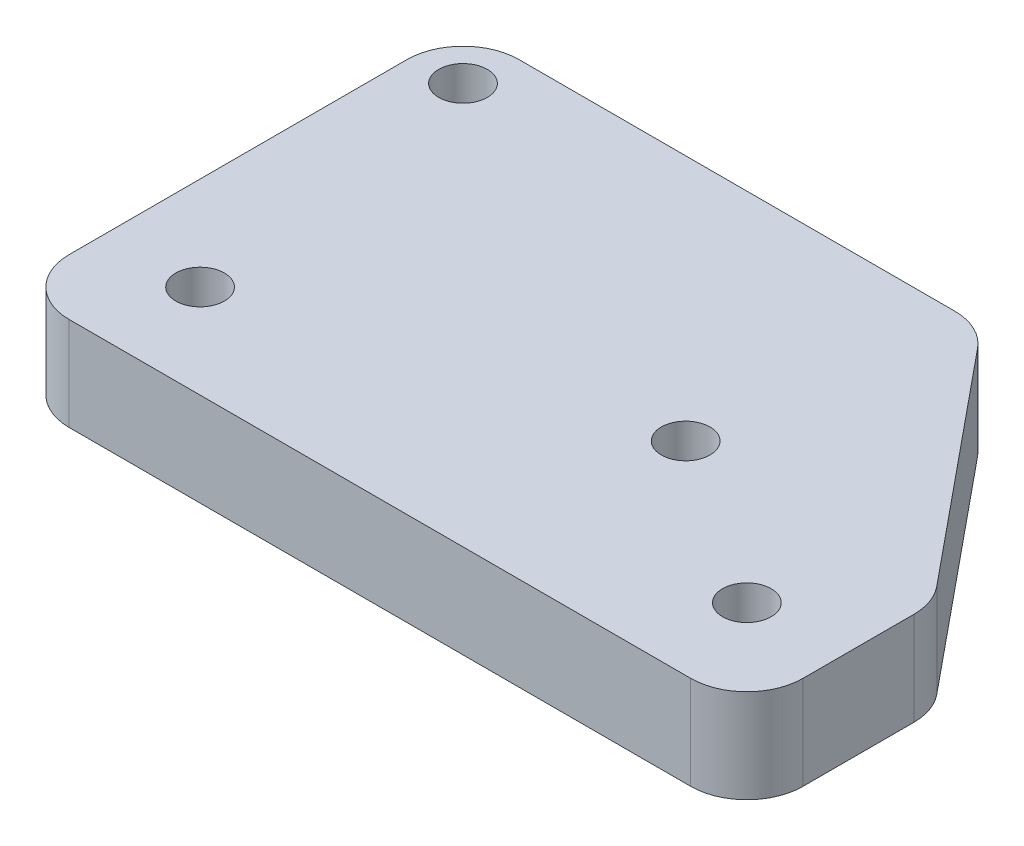
ISO-10303-21;
HEADER;
FILE_DESCRIPTION(('STEP AP214'),'2;1');
FILE_NAME('part.step','',(''),(''),'','','');
FILE_SCHEMA(('AUTOMOTIVE_DESIGN { 1 0 10303 214 1 1 1 1 }'));
ENDSEC;
DATA;
#1=APPLICATION_CONTEXT('core data for automotive mechanical design processes');
#2=APPLICATION_PROTOCOL_DEFINITION('international standard','automotive_design',2000,#1);
#3=PRODUCT_CONTEXT('',#1,'mechanical');
#4=PRODUCT('Part','Part','',(#3));
#5=PRODUCT_RELATED_PRODUCT_CATEGORY('part','',(#4));
#6=PRODUCT_DEFINITION_FORMATION('','',#4);
#7=PRODUCT_DEFINITION_CONTEXT('part definition',#1,'design');
#8=PRODUCT_DEFINITION('design','',#6,#7);
#9=PRODUCT_DEFINITION_SHAPE('','',#8);
#10=(LENGTH_UNIT() NAMED_UNIT(*) SI_UNIT(.MILLI.,.METRE.));
#11=(NAMED_UNIT(*) PLANE_ANGLE_UNIT() SI_UNIT($,.RADIAN.));
#12=(NAMED_UNIT(*) SI_UNIT($,.STERADIAN.) SOLID_ANGLE_UNIT());
#13=UNCERTAINTY_MEASURE_WITH_UNIT(LENGTH_MEASURE(1.E-05),#10,'distance_accuracy_value','');
#14=(GEOMETRIC_REPRESENTATION_CONTEXT(3) GLOBAL_UNCERTAINTY_ASSIGNED_CONTEXT((#13)) GLOBAL_UNIT_ASSIGNED_CONTEXT((#10,
#11,#12)) REPRESENTATION_CONTEXT('',''));
#15=CARTESIAN_POINT('',(0.,0.,0.));
#16=DIRECTION('',(0.,0.,1.));
#17=DIRECTION('',(1.,0.,0.));
#18=AXIS2_PLACEMENT_3D('',#15,#16,#17);
#19=CARTESIAN_POINT('',(-13.85,5.,-7.9));
#20=DIRECTION('',(0.,0.,1.));
#21=DIRECTION('',(1.,0.,0.));
#22=AXIS2_PLACEMENT_3D('',#19,#20,#21);
#23=PLANE('',#22);
#24=DIRECTION('',(-1.,0.,0.));
#25=VECTOR('',#24,1.);
#26=CARTESIAN_POINT('',(-13.85,0.,-7.9));
#27=LINE('',#26,#25);
#28=CARTESIAN_POINT('',(12.4302827055357,0.,-7.9));
#29=VERTEX_POINT('',#28);
#30=CARTESIAN_POINT('',(-10.85,0.,-7.9));
#31=VERTEX_POINT('',#30);
#32=EDGE_CURVE('E154',#29,#31,#27,.T.);
#33=ORIENTED_EDGE('',*,*,#32,.T.);
#34=DIRECTION('',(0.,-1.,0.));
#35=VECTOR('',#34,1.);
#36=CARTESIAN_POINT('',(-10.85,5.,-7.9));
#37=LINE('',#36,#35);
#38=CARTESIAN_POINT('',(-10.85,5.,-7.9));
#39=VERTEX_POINT('',#38);
#40=EDGE_CURVE('E128',#31,#39,#37,.F.);
#41=ORIENTED_EDGE('',*,*,#40,.T.);
#42=DIRECTION('',(-1.,0.,0.));
#43=VECTOR('',#42,1.);
#44=CARTESIAN_POINT('',(-13.85,5.,-7.9));
#45=LINE('',#44,#43);
#46=CARTESIAN_POINT('',(12.4302827055357,5.,-7.9));
#47=VERTEX_POINT('',#46);
#48=EDGE_CURVE('E153',#47,#39,#45,.T.);
#49=ORIENTED_EDGE('',*,*,#48,.F.);
#50=DIRECTION('',(0.,-1.,0.));
#51=VECTOR('',#50,1.);
#52=CARTESIAN_POINT('',(12.4302827055357,5.,-7.9));
#53=LINE('',#52,#51);
#54=EDGE_CURVE('E197',#47,#29,#53,.T.);
#55=ORIENTED_EDGE('',*,*,#54,.T.);
#56=EDGE_LOOP('',(#33,#41,#49,#55));
#57=FACE_BOUND('',#56,.T.);
#58=ADVANCED_FACE('F44',(#57),#23,.F.);
#59=CARTESIAN_POINT('',(-13.85,5.,7.9));
#60=DIRECTION('',(1.,0.,0.));
#61=DIRECTION('',(0.,0.,-1.));
#62=AXIS2_PLACEMENT_3D('',#59,#60,#61);
#63=PLANE('',#62);
#64=DIRECTION('',(0.,0.,1.));
#65=VECTOR('',#64,1.);
#66=CARTESIAN_POINT('',(-13.85,0.,7.9));
#67=LINE('',#66,#65);
#68=CARTESIAN_POINT('',(-13.85,0.,-4.9));
#69=VERTEX_POINT('',#68);
#70=CARTESIAN_POINT('',(-13.85,0.,13.15));
#71=VERTEX_POINT('',#70);
#72=EDGE_CURVE('E141',#69,#71,#67,.T.);
#73=ORIENTED_EDGE('',*,*,#72,.T.);
#74=DIRECTION('',(0.,1.,0.));
#75=VECTOR('',#74,1.);
#76=CARTESIAN_POINT('',(-13.85,5.,13.15));
#77=LINE('',#76,#75);
#78=CARTESIAN_POINT('',(-13.85,5.,13.15));
#79=VERTEX_POINT('',#78);
#80=EDGE_CURVE('E146',#71,#79,#77,.T.);
#81=ORIENTED_EDGE('',*,*,#80,.T.);
#82=DIRECTION('',(0.,0.,1.));
#83=VECTOR('',#82,1.);
#84=CARTESIAN_POINT('',(-13.85,5.,7.9));
#85=LINE('',#84,#83);
#86=CARTESIAN_POINT('',(-13.85,5.,-4.9));
#87=VERTEX_POINT('',#86);
#88=EDGE_CURVE('E144',#87,#79,#85,.T.);
#89=ORIENTED_EDGE('',*,*,#88,.F.);
#90=DIRECTION('',(0.,-1.,0.));
#91=VECTOR('',#90,1.);
#92=CARTESIAN_POINT('',(-13.85,5.,-4.9));
#93=LINE('',#92,#91);
#94=EDGE_CURVE('E127',#87,#69,#93,.T.);
#95=ORIENTED_EDGE('',*,*,#94,.T.);
#96=EDGE_LOOP('',(#73,#81,#89,#95));
#97=FACE_BOUND('',#96,.T.);
#98=ADVANCED_FACE('F139',(#97),#63,.F.);
#99=CARTESIAN_POINT('',(0.,5.,0.));
#100=DIRECTION('',(0.,-1.,0.));
#101=DIRECTION('',(0.,0.,-1.));
#102=AXIS2_PLACEMENT_3D('',#99,#100,#101);
#103=PLANE('',#102);
#104=ORIENTED_EDGE('',*,*,#88,.T.);
#105=CARTESIAN_POINT('',(-10.85,5.,13.15));
#106=DIRECTION('',(0.,-1.,0.));
#107=DIRECTION('',(0.,0.,-1.));
#108=AXIS2_PLACEMENT_3D('',#105,#106,#107);
#109=CIRCLE('',#108,3.);
#110=CARTESIAN_POINT('',(-10.85,5.,16.15));
#111=VERTEX_POINT('',#110);
#112=EDGE_CURVE('E178',#79,#111,#109,.F.);
#113=ORIENTED_EDGE('',*,*,#112,.T.);
#114=DIRECTION('',(1.,0.,0.));
#115=VECTOR('',#114,1.);
#116=CARTESIAN_POINT('',(0.,5.,16.15));
#117=LINE('',#116,#115);
#118=CARTESIAN_POINT('',(22.37,5.,16.15));
#119=VERTEX_POINT('',#118);
#120=EDGE_CURVE('E220',#111,#119,#117,.T.);
#121=ORIENTED_EDGE('',*,*,#120,.T.);
#122=CARTESIAN_POINT('',(22.37,5.,13.15));
#123=DIRECTION('',(0.,-1.,0.));
#124=DIRECTION('',(0.,0.,-1.));
#125=AXIS2_PLACEMENT_3D('',#122,#123,#124);
#126=CIRCLE('',#125,3.);
#127=CARTESIAN_POINT('',(25.37,5.,13.15));
#128=VERTEX_POINT('',#127);
#129=EDGE_CURVE('E166',#119,#128,#126,.F.);
#130=ORIENTED_EDGE('',*,*,#129,.T.);
#131=DIRECTION('',(0.,0.,1.));
#132=VECTOR('',#131,1.);
#133=CARTESIAN_POINT('',(25.37,5.,0.));
#134=LINE('',#133,#132);
#135=CARTESIAN_POINT('',(25.37,5.,7.22265867944652));
#136=VERTEX_POINT('',#135);
#137=EDGE_CURVE('E269',#136,#128,#134,.T.);
#138=ORIENTED_EDGE('',*,*,#137,.F.);
#139=CARTESIAN_POINT('',(22.37,5.,7.22265867944652));
#140=DIRECTION('',(0.,-1.,0.));
#141=DIRECTION('',(0.,0.,-1.));
#142=AXIS2_PLACEMENT_3D('',#139,#140,#141);
#143=CIRCLE('',#142,3.);
#144=CARTESIAN_POINT('',(24.6898843281208,5.,5.32051864670979));
#145=VERTEX_POINT('',#144);
#146=EDGE_CURVE('E169',#136,#145,#143,.F.);
#147=ORIENTED_EDGE('',*,*,#146,.T.);
#148=DIRECTION('',(0.634046677578912,0.,0.773294776040252));
#149=VECTOR('',#148,1.);
#150=CARTESIAN_POINT('',(12.1554989974642,5.,-9.96664401784965));
#151=LINE('',#150,#149);
#152=CARTESIAN_POINT('',(14.7501670336564,5.,-6.80214003273673));
#153=VERTEX_POINT('',#152);
#154=EDGE_CURVE('E226',#153,#145,#151,.T.);
#155=ORIENTED_EDGE('',*,*,#154,.F.);
#156=CARTESIAN_POINT('',(12.4302827055357,5.,-4.9));
#157=DIRECTION('',(0.,-1.,0.));
#158=DIRECTION('',(0.,0.,-1.));
#159=AXIS2_PLACEMENT_3D('',#156,#157,#158);
#160=CIRCLE('',#159,3.);
#161=EDGE_CURVE('E172',#153,#47,#160,.F.);
#162=ORIENTED_EDGE('',*,*,#161,.T.);
#163=ORIENTED_EDGE('',*,*,#48,.T.);
#164=CARTESIAN_POINT('',(-10.85,5.,-4.9));
#165=DIRECTION('',(0.,-1.,0.));
#166=DIRECTION('',(0.,0.,-1.));
#167=AXIS2_PLACEMENT_3D('',#164,#165,#166);
#168=CIRCLE('',#167,3.);
#169=EDGE_CURVE('E175',#39,#87,#168,.F.);
#170=ORIENTED_EDGE('',*,*,#169,.T.);
#171=EDGE_LOOP('',(#104,#113,#121,#130,#138,#147,#155,#162,#163,#170));
#172=FACE_BOUND('',#171,.T.);
#173=CARTESIAN_POINT('',(-11.25,5.,-5.3));
#174=DIRECTION('',(0.,1.,0.));
#175=DIRECTION('',(0.,0.,1.));
#176=AXIS2_PLACEMENT_3D('',#173,#174,#175);
#177=CIRCLE('',#176,1.3);
#178=CARTESIAN_POINT('',(-11.25,5.,-4.));
#179=VERTEX_POINT('',#178);
#180=EDGE_CURVE('E245',#179,#179,#177,.T.);
#181=ORIENTED_EDGE('',*,*,#180,.F.);
#182=EDGE_LOOP('',(#181));
#183=FACE_BOUND('',#182,.T.);
#184=CARTESIAN_POINT('',(11.25,5.,5.3));
#185=DIRECTION('',(0.,1.,0.));
#186=DIRECTION('',(0.,0.,1.));
#187=AXIS2_PLACEMENT_3D('',#184,#185,#186);
#188=CIRCLE('',#187,1.3);
#189=CARTESIAN_POINT('',(11.25,5.,6.6));
#190=VERTEX_POINT('',#189);
#191=EDGE_CURVE('E253',#190,#190,#188,.T.);
#192=ORIENTED_EDGE('',*,*,#191,.F.);
#193=EDGE_LOOP('',(#192));
#194=FACE_BOUND('',#193,.T.);
#195=CARTESIAN_POINT('',(20.37,5.,11.15));
#196=DIRECTION('',(0.,1.,0.));
#197=DIRECTION('',(0.,0.,1.));
#198=AXIS2_PLACEMENT_3D('',#195,#196,#197);
#199=CIRCLE('',#198,1.3);
#200=CARTESIAN_POINT('',(20.37,5.,12.45));
#201=VERTEX_POINT('',#200);
#202=EDGE_CURVE('E225',#201,#201,#199,.T.);
#203=ORIENTED_EDGE('',*,*,#202,.F.);
#204=EDGE_LOOP('',(#203));
#205=FACE_BOUND('',#204,.T.);
#206=CARTESIAN_POINT('',(-8.84999999999999,5.,11.15));
#207=DIRECTION('',(0.,1.,0.));
#208=DIRECTION('',(0.,0.,1.));
#209=AXIS2_PLACEMENT_3D('',#206,#207,#208);
#210=CIRCLE('',#209,1.3);
#211=CARTESIAN_POINT('',(-8.84999999999999,5.,12.45));
#212=VERTEX_POINT('',#211);
#213=EDGE_CURVE('E232',#212,#212,#210,.F.);
#214=ORIENTED_EDGE('',*,*,#213,.T.);
#215=EDGE_LOOP('',(#214));
#216=FACE_BOUND('',#215,.T.);
#217=ADVANCED_FACE('F292',(#172,#183,#194,#205,#216),#103,.F.);
#218=CARTESIAN_POINT('',(0.,0.,0.));
#219=DIRECTION('',(0.,-1.,0.));
#220=DIRECTION('',(0.,0.,-1.));
#221=AXIS2_PLACEMENT_3D('',#218,#219,#220);
#222=PLANE('',#221);
#223=DIRECTION('',(1.,0.,0.));
#224=VECTOR('',#223,1.);
#225=CARTESIAN_POINT('',(0.,0.,16.15));
#226=LINE('',#225,#224);
#227=CARTESIAN_POINT('',(-10.85,0.,16.15));
#228=VERTEX_POINT('',#227);
#229=CARTESIAN_POINT('',(22.37,0.,16.15));
#230=VERTEX_POINT('',#229);
#231=EDGE_CURVE('E276',#228,#230,#226,.T.);
#232=ORIENTED_EDGE('',*,*,#231,.F.);
#233=CARTESIAN_POINT('',(-10.85,0.,13.15));
#234=DIRECTION('',(0.,-1.,0.));
#235=DIRECTION('',(0.,0.,-1.));
#236=AXIS2_PLACEMENT_3D('',#233,#234,#235);
#237=CIRCLE('',#236,3.);
#238=EDGE_CURVE('E133',#228,#71,#237,.T.);
#239=ORIENTED_EDGE('',*,*,#238,.T.);
#240=ORIENTED_EDGE('',*,*,#72,.F.);
#241=CARTESIAN_POINT('',(-10.85,0.,-4.9));
#242=DIRECTION('',(0.,-1.,0.));
#243=DIRECTION('',(0.,0.,-1.));
#244=AXIS2_PLACEMENT_3D('',#241,#242,#243);
#245=CIRCLE('',#244,3.);
#246=EDGE_CURVE('E123',#69,#31,#245,.T.);
#247=ORIENTED_EDGE('',*,*,#246,.T.);
#248=ORIENTED_EDGE('',*,*,#32,.F.);
#249=CARTESIAN_POINT('',(12.4302827055357,0.,-4.9));
#250=DIRECTION('',(0.,-1.,0.));
#251=DIRECTION('',(0.,0.,-1.));
#252=AXIS2_PLACEMENT_3D('',#249,#250,#251);
#253=CIRCLE('',#252,3.);
#254=CARTESIAN_POINT('',(14.7501670336564,0.,-6.80214003273673));
#255=VERTEX_POINT('',#254);
#256=EDGE_CURVE('E134',#29,#255,#253,.T.);
#257=ORIENTED_EDGE('',*,*,#256,.T.);
#258=DIRECTION('',(0.634046677578912,0.,0.773294776040252));
#259=VECTOR('',#258,1.);
#260=CARTESIAN_POINT('',(12.1554989974642,0.,-9.96664401784965));
#261=LINE('',#260,#259);
#262=CARTESIAN_POINT('',(24.6898843281208,0.,5.32051864670978));
#263=VERTEX_POINT('',#262);
#264=EDGE_CURVE('E241',#255,#263,#261,.T.);
#265=ORIENTED_EDGE('',*,*,#264,.T.);
#266=CARTESIAN_POINT('',(22.37,0.,7.22265867944652));
#267=DIRECTION('',(0.,-1.,0.));
#268=DIRECTION('',(0.,0.,-1.));
#269=AXIS2_PLACEMENT_3D('',#266,#267,#268);
#270=CIRCLE('',#269,3.);
#271=CARTESIAN_POINT('',(25.37,0.,7.22265867944652));
#272=VERTEX_POINT('',#271);
#273=EDGE_CURVE('E66',#263,#272,#270,.T.);
#274=ORIENTED_EDGE('',*,*,#273,.T.);
#275=DIRECTION('',(0.,0.,1.));
#276=VECTOR('',#275,1.);
#277=CARTESIAN_POINT('',(25.37,0.,0.));
#278=LINE('',#277,#276);
#279=CARTESIAN_POINT('',(25.37,0.,13.15));
#280=VERTEX_POINT('',#279);
#281=EDGE_CURVE('E267',#272,#280,#278,.T.);
#282=ORIENTED_EDGE('',*,*,#281,.T.);
#283=CARTESIAN_POINT('',(22.37,0.,13.15));
#284=DIRECTION('',(0.,-1.,0.));
#285=DIRECTION('',(0.,0.,-1.));
#286=AXIS2_PLACEMENT_3D('',#283,#284,#285);
#287=CIRCLE('',#286,3.);
#288=EDGE_CURVE('E188',#280,#230,#287,.T.);
#289=ORIENTED_EDGE('',*,*,#288,.T.);
#290=EDGE_LOOP('',(#232,#239,#240,#247,#248,#257,#265,#274,#282,#289));
#291=FACE_BOUND('',#290,.T.);
#292=CARTESIAN_POINT('',(-11.25,0.,-5.3));
#293=DIRECTION('',(0.,1.,0.));
#294=DIRECTION('',(0.,0.,1.));
#295=AXIS2_PLACEMENT_3D('',#292,#293,#294);
#296=CIRCLE('',#295,1.3);
#297=CARTESIAN_POINT('',(-11.25,0.,-4.));
#298=VERTEX_POINT('',#297);
#299=EDGE_CURVE('E160',#298,#298,#296,.T.);
#300=ORIENTED_EDGE('',*,*,#299,.T.);
#301=EDGE_LOOP('',(#300));
#302=FACE_BOUND('',#301,.T.);
#303=CARTESIAN_POINT('',(11.25,0.,5.3));
#304=DIRECTION('',(0.,1.,0.));
#305=DIRECTION('',(0.,0.,1.));
#306=AXIS2_PLACEMENT_3D('',#303,#304,#305);
#307=CIRCLE('',#306,1.3);
#308=CARTESIAN_POINT('',(11.25,0.,6.6));
#309=VERTEX_POINT('',#308);
#310=EDGE_CURVE('E250',#309,#309,#307,.T.);
#311=ORIENTED_EDGE('',*,*,#310,.T.);
#312=EDGE_LOOP('',(#311));
#313=FACE_BOUND('',#312,.T.);
#314=CARTESIAN_POINT('',(-8.84999999999999,0.,11.15));
#315=DIRECTION('',(0.,-1.,0.));
#316=DIRECTION('',(0.,0.,-1.));
#317=AXIS2_PLACEMENT_3D('',#314,#315,#316);
#318=CIRCLE('',#317,1.3);
#319=CARTESIAN_POINT('',(-8.84999999999999,0.,9.85000000000001));
#320=VERTEX_POINT('',#319);
#321=EDGE_CURVE('E237',#320,#320,#318,.T.);
#322=ORIENTED_EDGE('',*,*,#321,.F.);
#323=EDGE_LOOP('',(#322));
#324=FACE_BOUND('',#323,.T.);
#325=CARTESIAN_POINT('',(20.37,0.,11.15));
#326=DIRECTION('',(0.,-1.,0.));
#327=DIRECTION('',(0.,0.,-1.));
#328=AXIS2_PLACEMENT_3D('',#325,#326,#327);
#329=CIRCLE('',#328,1.3);
#330=CARTESIAN_POINT('',(20.37,0.,9.85000000000001));
#331=VERTEX_POINT('',#330);
#332=EDGE_CURVE('E236',#331,#331,#329,.F.);
#333=ORIENTED_EDGE('',*,*,#332,.T.);
#334=EDGE_LOOP('',(#333));
#335=FACE_BOUND('',#334,.T.);
#336=ADVANCED_FACE('F149',(#291,#302,#313,#324,#335),#222,.T.);
#337=CARTESIAN_POINT('',(11.25,0.,5.3));
#338=DIRECTION('',(0.,1.,0.));
#339=DIRECTION('',(0.,0.,1.));
#340=AXIS2_PLACEMENT_3D('',#337,#338,#339);
#341=CYLINDRICAL_SURFACE('',#340,1.3);
#342=ORIENTED_EDGE('',*,*,#310,.F.);
#343=EDGE_LOOP('',(#342));
#344=FACE_BOUND('',#343,.T.);
#345=ORIENTED_EDGE('',*,*,#191,.T.);
#346=EDGE_LOOP('',(#345));
#347=FACE_BOUND('',#346,.T.);
#348=ADVANCED_FACE('F322',(#344,#347),#341,.F.);
#349=CARTESIAN_POINT('',(-11.25,0.,-5.3));
#350=DIRECTION('',(0.,1.,0.));
#351=DIRECTION('',(0.,0.,1.));
#352=AXIS2_PLACEMENT_3D('',#349,#350,#351);
#353=CYLINDRICAL_SURFACE('',#352,1.3);
#354=ORIENTED_EDGE('',*,*,#299,.F.);
#355=EDGE_LOOP('',(#354));
#356=FACE_BOUND('',#355,.T.);
#357=ORIENTED_EDGE('',*,*,#180,.T.);
#358=EDGE_LOOP('',(#357));
#359=FACE_BOUND('',#358,.T.);
#360=ADVANCED_FACE('F327',(#356,#359),#353,.F.);
#361=CARTESIAN_POINT('',(20.37,-46.0066397381943,11.15));
#362=DIRECTION('',(0.,1.,0.));
#363=DIRECTION('',(0.,0.,1.));
#364=AXIS2_PLACEMENT_3D('',#361,#362,#363);
#365=CYLINDRICAL_SURFACE('',#364,1.3);
#366=ORIENTED_EDGE('',*,*,#202,.T.);
#367=EDGE_LOOP('',(#366));
#368=FACE_BOUND('',#367,.T.);
#369=ORIENTED_EDGE('',*,*,#332,.F.);
#370=EDGE_LOOP('',(#369));
#371=FACE_BOUND('',#370,.T.);
#372=ADVANCED_FACE('F331',(#368,#371),#365,.F.);
#373=CARTESIAN_POINT('',(12.1554989974642,-46.0066397381943,-9.96664401784965));
#374=DIRECTION('',(-0.773294776040252,0.,0.634046677578912));
#375=DIRECTION('',(0.634046677578912,0.,0.773294776040252));
#376=AXIS2_PLACEMENT_3D('',#373,#374,#375);
#377=PLANE('',#376);
#378=ORIENTED_EDGE('',*,*,#264,.F.);
#379=DIRECTION('',(0.,-1.,0.));
#380=VECTOR('',#379,1.);
#381=CARTESIAN_POINT('',(14.7501670336564,-46.0066397381943,-6.80214003273673));
#382=LINE('',#381,#380);
#383=EDGE_CURVE('E206',#255,#153,#382,.F.);
#384=ORIENTED_EDGE('',*,*,#383,.T.);
#385=ORIENTED_EDGE('',*,*,#154,.T.);
#386=DIRECTION('',(0.,1.,0.));
#387=VECTOR('',#386,1.);
#388=CARTESIAN_POINT('',(24.6898843281208,-46.0066397381943,5.32051864670978));
#389=LINE('',#388,#387);
#390=EDGE_CURVE('E203',#145,#263,#389,.F.);
#391=ORIENTED_EDGE('',*,*,#390,.T.);
#392=EDGE_LOOP('',(#378,#384,#385,#391));
#393=FACE_BOUND('',#392,.T.);
#394=ADVANCED_FACE('F335',(#393),#377,.F.);
#395=CARTESIAN_POINT('',(0.,-46.0066397381943,16.15));
#396=DIRECTION('',(0.,0.,1.));
#397=DIRECTION('',(1.,0.,0.));
#398=AXIS2_PLACEMENT_3D('',#395,#396,#397);
#399=PLANE('',#398);
#400=ORIENTED_EDGE('',*,*,#120,.F.);
#401=DIRECTION('',(0.,1.,0.));
#402=VECTOR('',#401,1.);
#403=CARTESIAN_POINT('',(-10.85,0.,16.15));
#404=LINE('',#403,#402);
#405=EDGE_CURVE('E185',#111,#228,#404,.F.);
#406=ORIENTED_EDGE('',*,*,#405,.T.);
#407=ORIENTED_EDGE('',*,*,#231,.T.);
#408=DIRECTION('',(0.,1.,0.));
#409=VECTOR('',#408,1.);
#410=CARTESIAN_POINT('',(22.37,5.,16.15));
#411=LINE('',#410,#409);
#412=EDGE_CURVE('E181',#230,#119,#411,.T.);
#413=ORIENTED_EDGE('',*,*,#412,.T.);
#414=EDGE_LOOP('',(#400,#406,#407,#413));
#415=FACE_BOUND('',#414,.T.);
#416=ADVANCED_FACE('F297',(#415),#399,.T.);
#417=CARTESIAN_POINT('',(25.37,-46.0066397381943,0.));
#418=DIRECTION('',(-1.,0.,0.));
#419=DIRECTION('',(0.,0.,1.));
#420=AXIS2_PLACEMENT_3D('',#417,#418,#419);
#421=PLANE('',#420);
#422=ORIENTED_EDGE('',*,*,#281,.F.);
#423=DIRECTION('',(0.,1.,0.));
#424=VECTOR('',#423,1.);
#425=CARTESIAN_POINT('',(25.37,-46.0066397381943,7.22265867944652));
#426=LINE('',#425,#424);
#427=EDGE_CURVE('E12',#272,#136,#426,.T.);
#428=ORIENTED_EDGE('',*,*,#427,.T.);
#429=ORIENTED_EDGE('',*,*,#137,.T.);
#430=DIRECTION('',(0.,1.,0.));
#431=VECTOR('',#430,1.);
#432=CARTESIAN_POINT('',(25.37,0.,13.15));
#433=LINE('',#432,#431);
#434=EDGE_CURVE('E53',#128,#280,#433,.F.);
#435=ORIENTED_EDGE('',*,*,#434,.T.);
#436=EDGE_LOOP('',(#422,#428,#429,#435));
#437=FACE_BOUND('',#436,.T.);
#438=ADVANCED_FACE('F291',(#437),#421,.F.);
#439=CARTESIAN_POINT('',(-8.84999999999999,-46.0066397381943,11.15));
#440=DIRECTION('',(0.,1.,0.));
#441=DIRECTION('',(0.,0.,1.));
#442=AXIS2_PLACEMENT_3D('',#439,#440,#441);
#443=CYLINDRICAL_SURFACE('',#442,1.3);
#444=ORIENTED_EDGE('',*,*,#213,.F.);
#445=EDGE_LOOP('',(#444));
#446=FACE_BOUND('',#445,.T.);
#447=ORIENTED_EDGE('',*,*,#321,.T.);
#448=EDGE_LOOP('',(#447));
#449=FACE_BOUND('',#448,.T.);
#450=ADVANCED_FACE('F302',(#446,#449),#443,.F.);
#451=CARTESIAN_POINT('',(-10.85,5.,13.15));
#452=DIRECTION('',(0.,-1.,0.));
#453=DIRECTION('',(0.,0.,-1.));
#454=AXIS2_PLACEMENT_3D('',#451,#452,#453);
#455=CYLINDRICAL_SURFACE('',#454,3.);
#456=ORIENTED_EDGE('',*,*,#238,.F.);
#457=ORIENTED_EDGE('',*,*,#405,.F.);
#458=ORIENTED_EDGE('',*,*,#112,.F.);
#459=ORIENTED_EDGE('',*,*,#80,.F.);
#460=EDGE_LOOP('',(#456,#457,#458,#459));
#461=FACE_BOUND('',#460,.T.);
#462=ADVANCED_FACE('F300',(#461),#455,.T.);
#463=CARTESIAN_POINT('',(-10.85,5.,-4.9));
#464=DIRECTION('',(0.,-1.,0.));
#465=DIRECTION('',(0.,0.,-1.));
#466=AXIS2_PLACEMENT_3D('',#463,#464,#465);
#467=CYLINDRICAL_SURFACE('',#466,3.);
#468=ORIENTED_EDGE('',*,*,#169,.F.);
#469=ORIENTED_EDGE('',*,*,#40,.F.);
#470=ORIENTED_EDGE('',*,*,#246,.F.);
#471=ORIENTED_EDGE('',*,*,#94,.F.);
#472=EDGE_LOOP('',(#468,#469,#470,#471));
#473=FACE_BOUND('',#472,.T.);
#474=ADVANCED_FACE('F126',(#473),#467,.T.);
#475=CARTESIAN_POINT('',(12.4302827055357,5.,-4.9));
#476=DIRECTION('',(0.,-1.,0.));
#477=DIRECTION('',(0.,0.,-1.));
#478=AXIS2_PLACEMENT_3D('',#475,#476,#477);
#479=CYLINDRICAL_SURFACE('',#478,3.);
#480=ORIENTED_EDGE('',*,*,#161,.F.);
#481=ORIENTED_EDGE('',*,*,#383,.F.);
#482=ORIENTED_EDGE('',*,*,#256,.F.);
#483=ORIENTED_EDGE('',*,*,#54,.F.);
#484=EDGE_LOOP('',(#480,#481,#482,#483));
#485=FACE_BOUND('',#484,.T.);
#486=ADVANCED_FACE('F308',(#485),#479,.T.);
#487=CARTESIAN_POINT('',(22.37,-46.0066397381943,7.22265867944652));
#488=DIRECTION('',(0.,1.,0.));
#489=DIRECTION('',(0.,0.,1.));
#490=AXIS2_PLACEMENT_3D('',#487,#488,#489);
#491=CYLINDRICAL_SURFACE('',#490,3.);
#492=ORIENTED_EDGE('',*,*,#273,.F.);
#493=ORIENTED_EDGE('',*,*,#390,.F.);
#494=ORIENTED_EDGE('',*,*,#146,.F.);
#495=ORIENTED_EDGE('',*,*,#427,.F.);
#496=EDGE_LOOP('',(#492,#493,#494,#495));
#497=FACE_BOUND('',#496,.T.);
#498=ADVANCED_FACE('F290',(#497),#491,.T.);
#499=CARTESIAN_POINT('',(22.37,-46.0066397381943,13.15));
#500=DIRECTION('',(0.,-1.,0.));
#501=DIRECTION('',(0.,0.,-1.));
#502=AXIS2_PLACEMENT_3D('',#499,#500,#501);
#503=CYLINDRICAL_SURFACE('',#502,3.);
#504=ORIENTED_EDGE('',*,*,#288,.F.);
#505=ORIENTED_EDGE('',*,*,#434,.F.);
#506=ORIENTED_EDGE('',*,*,#129,.F.);
#507=ORIENTED_EDGE('',*,*,#412,.F.);
#508=EDGE_LOOP('',(#504,#505,#506,#507));
#509=FACE_BOUND('',#508,.T.);
#510=ADVANCED_FACE('F46',(#509),#503,.T.);
#511=CLOSED_SHELL('',(#58,#98,#217,#336,#348,#360,#372,#394,#416,#438,#450,#462,#474,#486,#498,#510));
#512=MANIFOLD_SOLID_BREP('B2',#511);
#513=ADVANCED_BREP_SHAPE_REPRESENTATION('',(#18,#512),#14);
#514=SHAPE_DEFINITION_REPRESENTATION(#9,#513);
ENDSEC;
END-ISO-10303-21;
